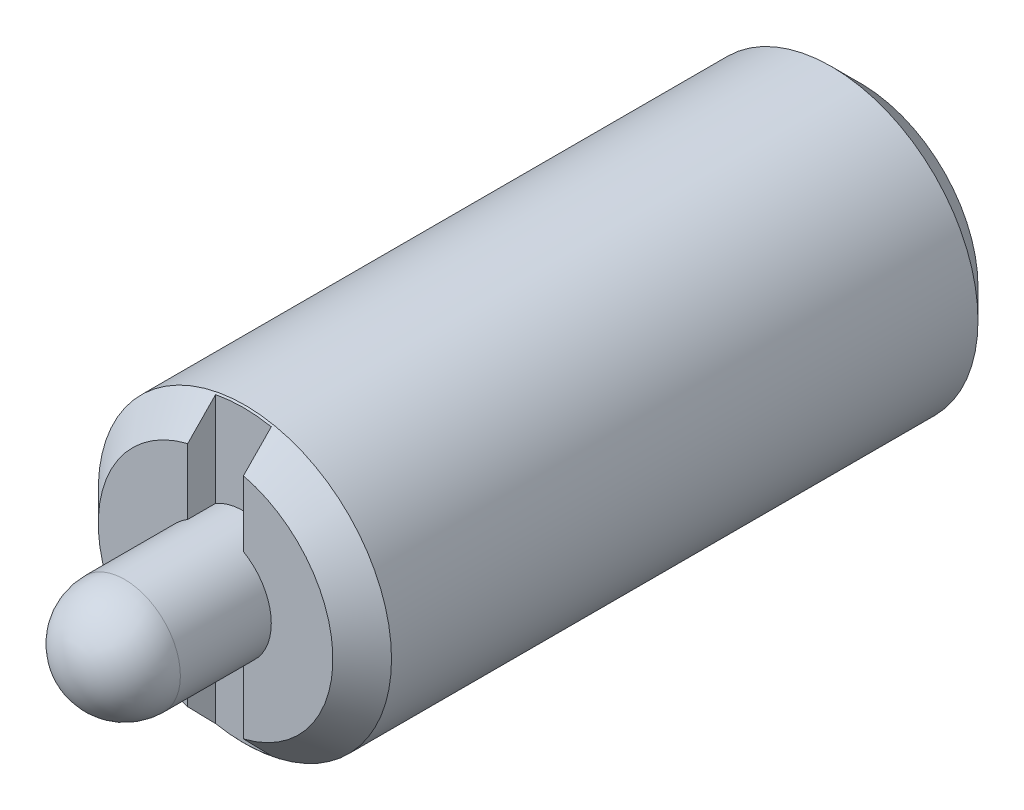
ISO-10303-21;
HEADER;
FILE_DESCRIPTION(('STEP AP214'),'2;1');
FILE_NAME('part.step','',(''),(''),'','','');
FILE_SCHEMA(('AUTOMOTIVE_DESIGN { 1 0 10303 214 1 1 1 1 }'));
ENDSEC;
DATA;
#1=APPLICATION_CONTEXT('core data for automotive mechanical design processes');
#2=APPLICATION_PROTOCOL_DEFINITION('international standard','automotive_design',2000,#1);
#3=PRODUCT_CONTEXT('',#1,'mechanical');
#4=PRODUCT('Part','Part','',(#3));
#5=PRODUCT_RELATED_PRODUCT_CATEGORY('part','',(#4));
#6=PRODUCT_DEFINITION_FORMATION('','',#4);
#7=PRODUCT_DEFINITION_CONTEXT('part definition',#1,'design');
#8=PRODUCT_DEFINITION('design','',#6,#7);
#9=PRODUCT_DEFINITION_SHAPE('','',#8);
#10=(LENGTH_UNIT() NAMED_UNIT(*) SI_UNIT(.MILLI.,.METRE.));
#11=(NAMED_UNIT(*) PLANE_ANGLE_UNIT() SI_UNIT($,.RADIAN.));
#12=(NAMED_UNIT(*) SI_UNIT($,.STERADIAN.) SOLID_ANGLE_UNIT());
#13=UNCERTAINTY_MEASURE_WITH_UNIT(LENGTH_MEASURE(1.E-05),#10,'distance_accuracy_value','');
#14=(GEOMETRIC_REPRESENTATION_CONTEXT(3) GLOBAL_UNCERTAINTY_ASSIGNED_CONTEXT((#13)) GLOBAL_UNIT_ASSIGNED_CONTEXT((#10,
#11,#12)) REPRESENTATION_CONTEXT('',''));
#15=CARTESIAN_POINT('',(0.,0.,0.));
#16=DIRECTION('',(0.,0.,1.));
#17=DIRECTION('',(1.,0.,0.));
#18=AXIS2_PLACEMENT_3D('',#15,#16,#17);
#19=CARTESIAN_POINT('',(0.,0.,0.));
#20=DIRECTION('',(0.,0.,-1.));
#21=DIRECTION('',(0.,-1.,0.));
#22=AXIS2_PLACEMENT_3D('',#19,#20,#21);
#23=PLANE('',#22);
#24=DIRECTION('',(0.866025403784439,0.5,0.));
#25=VECTOR('',#24,1.);
#26=CARTESIAN_POINT('',(0.75,-1.29903810567666,0.));
#27=LINE('',#26,#25);
#28=CARTESIAN_POINT('',(0.,-1.73205080756888,0.));
#29=VERTEX_POINT('',#28);
#30=CARTESIAN_POINT('',(1.5,-0.866025403784438,0.));
#31=VERTEX_POINT('',#30);
#32=EDGE_CURVE('E150',#29,#31,#27,.T.);
#33=ORIENTED_EDGE('',*,*,#32,.T.);
#34=DIRECTION('',(0.,1.,0.));
#35=VECTOR('',#34,1.);
#36=CARTESIAN_POINT('',(1.5,0.,0.));
#37=LINE('',#36,#35);
#38=CARTESIAN_POINT('',(1.5,0.866025403784438,0.));
#39=VERTEX_POINT('',#38);
#40=EDGE_CURVE('E250',#31,#39,#37,.T.);
#41=ORIENTED_EDGE('',*,*,#40,.T.);
#42=DIRECTION('',(-0.866025403784439,0.5,0.));
#43=VECTOR('',#42,1.);
#44=CARTESIAN_POINT('',(0.75,1.29903810567666,0.));
#45=LINE('',#44,#43);
#46=CARTESIAN_POINT('',(0.,1.73205080756888,0.));
#47=VERTEX_POINT('',#46);
#48=EDGE_CURVE('E243',#39,#47,#45,.T.);
#49=ORIENTED_EDGE('',*,*,#48,.T.);
#50=DIRECTION('',(-0.866025403784439,-0.5,0.));
#51=VECTOR('',#50,1.);
#52=CARTESIAN_POINT('',(-0.75,1.29903810567666,0.));
#53=LINE('',#52,#51);
#54=CARTESIAN_POINT('',(-1.5,0.866025403784438,0.));
#55=VERTEX_POINT('',#54);
#56=EDGE_CURVE('E218',#47,#55,#53,.T.);
#57=ORIENTED_EDGE('',*,*,#56,.T.);
#58=DIRECTION('',(0.,-1.,0.));
#59=VECTOR('',#58,1.);
#60=CARTESIAN_POINT('',(-1.5,0.,0.));
#61=LINE('',#60,#59);
#62=CARTESIAN_POINT('',(-1.5,-0.866025403784439,0.));
#63=VERTEX_POINT('',#62);
#64=EDGE_CURVE('E219',#55,#63,#61,.T.);
#65=ORIENTED_EDGE('',*,*,#64,.T.);
#66=DIRECTION('',(0.866025403784439,-0.5,0.));
#67=VECTOR('',#66,1.);
#68=CARTESIAN_POINT('',(-0.75,-1.29903810567666,0.));
#69=LINE('',#68,#67);
#70=EDGE_CURVE('E146',#63,#29,#69,.T.);
#71=ORIENTED_EDGE('',*,*,#70,.T.);
#72=EDGE_LOOP('',(#33,#41,#49,#57,#65,#71));
#73=FACE_BOUND('',#72,.T.);
#74=CARTESIAN_POINT('',(0.,0.,0.));
#75=DIRECTION('',(0.,0.,1.));
#76=DIRECTION('',(-1.,0.,0.));
#77=AXIS2_PLACEMENT_3D('',#74,#75,#76);
#78=CIRCLE('',#77,4.);
#79=CARTESIAN_POINT('',(4.,0.,0.));
#80=VERTEX_POINT('',#79);
#81=EDGE_CURVE('E11',#80,#80,#78,.T.);
#82=ORIENTED_EDGE('',*,*,#81,.F.);
#83=EDGE_LOOP('',(#82));
#84=FACE_BOUND('',#83,.T.);
#85=ADVANCED_FACE('F16',(#73,#84),#23,.T.);
#86=CARTESIAN_POINT('',(0.,0.,0.));
#87=DIRECTION('',(0.,0.,1.));
#88=DIRECTION('',(-1.,0.,0.));
#89=AXIS2_PLACEMENT_3D('',#86,#87,#88);
#90=CONICAL_SURFACE('',#89,4.,0.785398163397448);
#91=ORIENTED_EDGE('',*,*,#81,.T.);
#92=EDGE_LOOP('',(#91));
#93=FACE_BOUND('',#92,.T.);
#94=CARTESIAN_POINT('',(0.,0.,1.));
#95=DIRECTION('',(0.,0.,-1.));
#96=DIRECTION('',(-1.,0.,0.));
#97=AXIS2_PLACEMENT_3D('',#94,#95,#96);
#98=CIRCLE('',#97,5.);
#99=CARTESIAN_POINT('',(5.,0.,1.));
#100=VERTEX_POINT('',#99);
#101=EDGE_CURVE('E29',#100,#100,#98,.T.);
#102=ORIENTED_EDGE('',*,*,#101,.T.);
#103=EDGE_LOOP('',(#102));
#104=FACE_BOUND('',#103,.T.);
#105=ADVANCED_FACE('F479',(#93,#104),#90,.T.);
#106=CARTESIAN_POINT('',(0.,0.,11.));
#107=DIRECTION('',(0.,0.,-1.));
#108=DIRECTION('',(1.,0.,0.));
#109=AXIS2_PLACEMENT_3D('',#106,#107,#108);
#110=CYLINDRICAL_SURFACE('',#109,5.);
#111=CARTESIAN_POINT('',(0.,0.,21.));
#112=DIRECTION('',(0.,0.,1.));
#113=DIRECTION('',(-1.,0.,0.));
#114=AXIS2_PLACEMENT_3D('',#111,#112,#113);
#115=CIRCLE('',#114,5.);
#116=CARTESIAN_POINT('',(5.,0.,21.));
#117=VERTEX_POINT('',#116);
#118=EDGE_CURVE('E198',#117,#117,#115,.T.);
#119=ORIENTED_EDGE('',*,*,#118,.F.);
#120=EDGE_LOOP('',(#119));
#121=FACE_BOUND('',#120,.T.);
#122=ORIENTED_EDGE('',*,*,#101,.F.);
#123=EDGE_LOOP('',(#122));
#124=FACE_BOUND('',#123,.T.);
#125=ADVANCED_FACE('F593',(#121,#124),#110,.T.);
#126=CARTESIAN_POINT('',(0.,0.,22.));
#127=DIRECTION('',(0.,0.,-1.));
#128=DIRECTION('',(-1.,0.,0.));
#129=AXIS2_PLACEMENT_3D('',#126,#127,#128);
#130=CONICAL_SURFACE('',#129,4.,0.785398163397448);
#131=CARTESIAN_POINT('',(0.95,-3.88555015409659,22.));
#132=CARTESIAN_POINT('',(0.95,-4.32015706650129,21.5778282611336));
#133=CARTESIAN_POINT('',(0.95,-4.85798312059645,21.05));
#134=(BOUNDED_CURVE() B_SPLINE_CURVE(2,(#131,#132,#133),.UNSPECIFIED.,.F.,
.F.) B_SPLINE_CURVE_WITH_KNOTS((3,3),(0.,1.35945903612283),
.UNSPECIFIED.) CURVE() GEOMETRIC_REPRESENTATION_ITEM() RATIONAL_B_SPLINE_CURVE((1.,
1.00595537951627,1.)) REPRESENTATION_ITEM(''));
#135=CARTESIAN_POINT('',(0.95,-3.88555015409659,22.));
#136=VERTEX_POINT('',#135);
#137=CARTESIAN_POINT('',(0.95,-4.85798312059645,21.05));
#138=VERTEX_POINT('',#137);
#139=EDGE_CURVE('E190',#136,#138,#134,.T.);
#140=ORIENTED_EDGE('',*,*,#139,.T.);
#141=CARTESIAN_POINT('',(0.,0.,21.05));
#142=DIRECTION('',(0.,0.,-1.));
#143=DIRECTION('',(-1.,0.,0.));
#144=AXIS2_PLACEMENT_3D('',#141,#142,#143);
#145=CIRCLE('',#144,4.95);
#146=CARTESIAN_POINT('',(-0.95,-4.85798312059645,21.05));
#147=VERTEX_POINT('',#146);
#148=EDGE_CURVE('E269',#138,#147,#145,.T.);
#149=ORIENTED_EDGE('',*,*,#148,.T.);
#150=CARTESIAN_POINT('',(-0.95,-4.85798312059645,21.05));
#151=CARTESIAN_POINT('',(-0.95,-4.32015706650129,21.5778282611336));
#152=CARTESIAN_POINT('',(-0.95,-3.88555015409659,22.));
#153=(BOUNDED_CURVE() B_SPLINE_CURVE(2,(#150,#151,#152),.UNSPECIFIED.,.F.,
.F.) B_SPLINE_CURVE_WITH_KNOTS((3,3),(0.,1.35945903612283),
.UNSPECIFIED.) CURVE() GEOMETRIC_REPRESENTATION_ITEM() RATIONAL_B_SPLINE_CURVE((1.,
1.00595537951627,1.)) REPRESENTATION_ITEM(''));
#154=CARTESIAN_POINT('',(-0.95,-3.88555015409659,22.));
#155=VERTEX_POINT('',#154);
#156=EDGE_CURVE('E293',#147,#155,#153,.T.);
#157=ORIENTED_EDGE('',*,*,#156,.T.);
#158=CARTESIAN_POINT('',(0.,0.,22.));
#159=DIRECTION('',(0.,0.,-1.));
#160=DIRECTION('',(-1.,0.,0.));
#161=AXIS2_PLACEMENT_3D('',#158,#159,#160);
#162=CIRCLE('',#161,4.);
#163=CARTESIAN_POINT('',(-0.95,3.88555015409659,22.));
#164=VERTEX_POINT('',#163);
#165=EDGE_CURVE('E239',#155,#164,#162,.T.);
#166=ORIENTED_EDGE('',*,*,#165,.T.);
#167=CARTESIAN_POINT('',(-0.95,3.88555015409659,22.));
#168=CARTESIAN_POINT('',(-0.95,4.32015706650129,21.5778282611336));
#169=CARTESIAN_POINT('',(-0.95,4.85798312059645,21.05));
#170=(BOUNDED_CURVE() B_SPLINE_CURVE(2,(#167,#168,#169),.UNSPECIFIED.,.F.,
.F.) B_SPLINE_CURVE_WITH_KNOTS((3,3),(0.,1.35945903612283),
.UNSPECIFIED.) CURVE() GEOMETRIC_REPRESENTATION_ITEM() RATIONAL_B_SPLINE_CURVE((1.,
1.00595537951627,1.)) REPRESENTATION_ITEM(''));
#171=CARTESIAN_POINT('',(-0.95,4.85798312059645,21.05));
#172=VERTEX_POINT('',#171);
#173=EDGE_CURVE('E20',#164,#172,#170,.T.);
#174=ORIENTED_EDGE('',*,*,#173,.T.);
#175=CARTESIAN_POINT('',(0.,0.,21.05));
#176=DIRECTION('',(0.,0.,-1.));
#177=DIRECTION('',(-1.,0.,0.));
#178=AXIS2_PLACEMENT_3D('',#175,#176,#177);
#179=CIRCLE('',#178,4.95);
#180=CARTESIAN_POINT('',(0.95,4.85798312059645,21.05));
#181=VERTEX_POINT('',#180);
#182=EDGE_CURVE('E237',#172,#181,#179,.T.);
#183=ORIENTED_EDGE('',*,*,#182,.T.);
#184=CARTESIAN_POINT('',(0.95,4.85798312059645,21.05));
#185=CARTESIAN_POINT('',(0.95,4.32015706650129,21.5778282611336));
#186=CARTESIAN_POINT('',(0.95,3.88555015409659,22.));
#187=(BOUNDED_CURVE() B_SPLINE_CURVE(2,(#184,#185,#186),.UNSPECIFIED.,.F.,
.F.) B_SPLINE_CURVE_WITH_KNOTS((3,3),(0.,1.35945903612283),
.UNSPECIFIED.) CURVE() GEOMETRIC_REPRESENTATION_ITEM() RATIONAL_B_SPLINE_CURVE((1.,
1.00595537951627,1.)) REPRESENTATION_ITEM(''));
#188=CARTESIAN_POINT('',(0.95,3.88555015409659,22.));
#189=VERTEX_POINT('',#188);
#190=EDGE_CURVE('E204',#181,#189,#187,.T.);
#191=ORIENTED_EDGE('',*,*,#190,.T.);
#192=CARTESIAN_POINT('',(0.,0.,22.));
#193=DIRECTION('',(0.,0.,-1.));
#194=DIRECTION('',(-1.,0.,0.));
#195=AXIS2_PLACEMENT_3D('',#192,#193,#194);
#196=CIRCLE('',#195,4.);
#197=EDGE_CURVE('E195',#189,#136,#196,.T.);
#198=ORIENTED_EDGE('',*,*,#197,.T.);
#199=EDGE_LOOP('',(#140,#149,#157,#166,#174,#183,#191,#198));
#200=FACE_BOUND('',#199,.T.);
#201=ORIENTED_EDGE('',*,*,#118,.T.);
#202=EDGE_LOOP('',(#201));
#203=FACE_BOUND('',#202,.T.);
#204=ADVANCED_FACE('F376',(#200,#203),#130,.T.);
#205=CARTESIAN_POINT('',(0.,0.,22.));
#206=DIRECTION('',(0.,0.,1.));
#207=DIRECTION('',(1.,0.,0.));
#208=AXIS2_PLACEMENT_3D('',#205,#206,#207);
#209=PLANE('',#208);
#210=CARTESIAN_POINT('',(0.,0.,22.));
#211=DIRECTION('',(0.,0.,-1.));
#212=DIRECTION('',(1.,0.,0.));
#213=AXIS2_PLACEMENT_3D('',#210,#211,#212);
#214=CIRCLE('',#213,1.9);
#215=CARTESIAN_POINT('',(-0.95,-1.64544826719043,22.));
#216=VERTEX_POINT('',#215);
#217=CARTESIAN_POINT('',(-0.95,1.64544826719043,22.));
#218=VERTEX_POINT('',#217);
#219=EDGE_CURVE('E203',#216,#218,#214,.T.);
#220=ORIENTED_EDGE('',*,*,#219,.T.);
#221=DIRECTION('',(0.,1.,0.));
#222=VECTOR('',#221,1.);
#223=CARTESIAN_POINT('',(-0.95,0.,22.));
#224=LINE('',#223,#222);
#225=EDGE_CURVE('E240',#218,#164,#224,.T.);
#226=ORIENTED_EDGE('',*,*,#225,.T.);
#227=ORIENTED_EDGE('',*,*,#165,.F.);
#228=DIRECTION('',(0.,1.,0.));
#229=VECTOR('',#228,1.);
#230=CARTESIAN_POINT('',(-0.95,0.,22.));
#231=LINE('',#230,#229);
#232=EDGE_CURVE('E279',#155,#216,#231,.T.);
#233=ORIENTED_EDGE('',*,*,#232,.T.);
#234=EDGE_LOOP('',(#220,#226,#227,#233));
#235=FACE_BOUND('',#234,.T.);
#236=ADVANCED_FACE('F401',(#235),#209,.T.);
#237=CARTESIAN_POINT('',(0.,0.,21.05));
#238=DIRECTION('',(0.,0.,1.));
#239=DIRECTION('',(1.,0.,0.));
#240=AXIS2_PLACEMENT_3D('',#237,#238,#239);
#241=PLANE('',#240);
#242=CARTESIAN_POINT('',(0.,0.,21.05));
#243=DIRECTION('',(0.,0.,-1.));
#244=DIRECTION('',(1.,0.,0.));
#245=AXIS2_PLACEMENT_3D('',#242,#243,#244);
#246=CIRCLE('',#245,1.9);
#247=CARTESIAN_POINT('',(-0.95,1.64544826719043,21.05));
#248=VERTEX_POINT('',#247);
#249=CARTESIAN_POINT('',(0.95,1.64544826719043,21.05));
#250=VERTEX_POINT('',#249);
#251=EDGE_CURVE('E228',#248,#250,#246,.T.);
#252=ORIENTED_EDGE('',*,*,#251,.T.);
#253=DIRECTION('',(0.,-1.,0.));
#254=VECTOR('',#253,1.);
#255=CARTESIAN_POINT('',(0.95,0.,21.05));
#256=LINE('',#255,#254);
#257=EDGE_CURVE('E210',#181,#250,#256,.T.);
#258=ORIENTED_EDGE('',*,*,#257,.F.);
#259=ORIENTED_EDGE('',*,*,#182,.F.);
#260=DIRECTION('',(0.,1.,0.));
#261=VECTOR('',#260,1.);
#262=CARTESIAN_POINT('',(-0.95,0.,21.05));
#263=LINE('',#262,#261);
#264=EDGE_CURVE('E260',#248,#172,#263,.T.);
#265=ORIENTED_EDGE('',*,*,#264,.F.);
#266=EDGE_LOOP('',(#252,#258,#259,#265));
#267=FACE_BOUND('',#266,.T.);
#268=ADVANCED_FACE('F409',(#267),#241,.T.);
#269=CARTESIAN_POINT('',(-0.95,0.,21.525));
#270=DIRECTION('',(1.,0.,0.));
#271=DIRECTION('',(0.,1.,0.));
#272=AXIS2_PLACEMENT_3D('',#269,#270,#271);
#273=PLANE('',#272);
#274=DIRECTION('',(0.,0.,-1.));
#275=VECTOR('',#274,1.);
#276=CARTESIAN_POINT('',(-0.95,1.64544826719043,21.525));
#277=LINE('',#276,#275);
#278=EDGE_CURVE('E317',#218,#248,#277,.T.);
#279=ORIENTED_EDGE('',*,*,#278,.T.);
#280=ORIENTED_EDGE('',*,*,#264,.T.);
#281=ORIENTED_EDGE('',*,*,#173,.F.);
#282=ORIENTED_EDGE('',*,*,#225,.F.);
#283=EDGE_LOOP('',(#279,#280,#281,#282));
#284=FACE_BOUND('',#283,.T.);
#285=ADVANCED_FACE('F406',(#284),#273,.T.);
#286=CARTESIAN_POINT('',(1.5,0.,1.1));
#287=DIRECTION('',(-1.,0.,0.));
#288=DIRECTION('',(0.,0.,1.));
#289=AXIS2_PLACEMENT_3D('',#286,#287,#288);
#290=PLANE('',#289);
#291=DIRECTION('',(0.,0.,-1.));
#292=VECTOR('',#291,1.);
#293=CARTESIAN_POINT('',(1.5,-0.866025403784438,1.1));
#294=LINE('',#293,#292);
#295=CARTESIAN_POINT('',(1.5,-0.866025403784438,2.2));
#296=VERTEX_POINT('',#295);
#297=EDGE_CURVE('E182',#296,#31,#294,.T.);
#298=ORIENTED_EDGE('',*,*,#297,.F.);
#299=DIRECTION('',(0.,1.,0.));
#300=VECTOR('',#299,1.);
#301=CARTESIAN_POINT('',(1.5,0.,2.2));
#302=LINE('',#301,#300);
#303=CARTESIAN_POINT('',(1.5,0.866025403784438,2.2));
#304=VERTEX_POINT('',#303);
#305=EDGE_CURVE('E173',#296,#304,#302,.T.);
#306=ORIENTED_EDGE('',*,*,#305,.T.);
#307=DIRECTION('',(0.,0.,-1.));
#308=VECTOR('',#307,1.);
#309=CARTESIAN_POINT('',(1.5,0.866025403784438,1.1));
#310=LINE('',#309,#308);
#311=EDGE_CURVE('E236',#304,#39,#310,.T.);
#312=ORIENTED_EDGE('',*,*,#311,.T.);
#313=ORIENTED_EDGE('',*,*,#40,.F.);
#314=EDGE_LOOP('',(#298,#306,#312,#313));
#315=FACE_BOUND('',#314,.T.);
#316=ADVANCED_FACE('F347',(#315),#290,.T.);
#317=CARTESIAN_POINT('',(0.75,1.29903810567666,1.1));
#318=DIRECTION('',(-0.5,-0.866025403784439,0.));
#319=DIRECTION('',(-0.866025403784439,0.5,0.));
#320=AXIS2_PLACEMENT_3D('',#317,#318,#319);
#321=PLANE('',#320);
#322=ORIENTED_EDGE('',*,*,#311,.F.);
#323=DIRECTION('',(-0.866025403784439,0.5,0.));
#324=VECTOR('',#323,1.);
#325=CARTESIAN_POINT('',(0.75,1.29903810567666,2.2));
#326=LINE('',#325,#324);
#327=CARTESIAN_POINT('',(0.,1.73205080756888,2.2));
#328=VERTEX_POINT('',#327);
#329=EDGE_CURVE('E183',#304,#328,#326,.T.);
#330=ORIENTED_EDGE('',*,*,#329,.T.);
#331=DIRECTION('',(0.,0.,-1.));
#332=VECTOR('',#331,1.);
#333=CARTESIAN_POINT('',(0.,1.73205080756888,1.1));
#334=LINE('',#333,#332);
#335=EDGE_CURVE('E211',#328,#47,#334,.T.);
#336=ORIENTED_EDGE('',*,*,#335,.T.);
#337=ORIENTED_EDGE('',*,*,#48,.F.);
#338=EDGE_LOOP('',(#322,#330,#336,#337));
#339=FACE_BOUND('',#338,.T.);
#340=ADVANCED_FACE('F350',(#339),#321,.T.);
#341=CARTESIAN_POINT('',(-0.75,1.29903810567666,1.1));
#342=DIRECTION('',(0.5,-0.866025403784439,0.));
#343=DIRECTION('',(0.,0.,-1.));
#344=AXIS2_PLACEMENT_3D('',#341,#342,#343);
#345=PLANE('',#344);
#346=ORIENTED_EDGE('',*,*,#335,.F.);
#347=DIRECTION('',(-0.866025403784439,-0.5,0.));
#348=VECTOR('',#347,1.);
#349=CARTESIAN_POINT('',(-0.75,1.29903810567666,2.2));
#350=LINE('',#349,#348);
#351=CARTESIAN_POINT('',(-1.5,0.866025403784438,2.2));
#352=VERTEX_POINT('',#351);
#353=EDGE_CURVE('E161',#328,#352,#350,.T.);
#354=ORIENTED_EDGE('',*,*,#353,.T.);
#355=DIRECTION('',(0.,0.,-1.));
#356=VECTOR('',#355,1.);
#357=CARTESIAN_POINT('',(-1.5,0.866025403784438,1.1));
#358=LINE('',#357,#356);
#359=EDGE_CURVE('E156',#352,#55,#358,.T.);
#360=ORIENTED_EDGE('',*,*,#359,.T.);
#361=ORIENTED_EDGE('',*,*,#56,.F.);
#362=EDGE_LOOP('',(#346,#354,#360,#361));
#363=FACE_BOUND('',#362,.T.);
#364=ADVANCED_FACE('F552',(#363),#345,.T.);
#365=CARTESIAN_POINT('',(-1.5,0.,1.1));
#366=DIRECTION('',(1.,0.,0.));
#367=DIRECTION('',(0.,1.,0.));
#368=AXIS2_PLACEMENT_3D('',#365,#366,#367);
#369=PLANE('',#368);
#370=ORIENTED_EDGE('',*,*,#359,.F.);
#371=DIRECTION('',(0.,-1.,0.));
#372=VECTOR('',#371,1.);
#373=CARTESIAN_POINT('',(-1.5,0.,2.2));
#374=LINE('',#373,#372);
#375=CARTESIAN_POINT('',(-1.5,-0.866025403784439,2.2));
#376=VERTEX_POINT('',#375);
#377=EDGE_CURVE('E153',#352,#376,#374,.T.);
#378=ORIENTED_EDGE('',*,*,#377,.T.);
#379=DIRECTION('',(0.,0.,-1.));
#380=VECTOR('',#379,1.);
#381=CARTESIAN_POINT('',(-1.5,-0.866025403784439,1.1));
#382=LINE('',#381,#380);
#383=EDGE_CURVE('E140',#376,#63,#382,.T.);
#384=ORIENTED_EDGE('',*,*,#383,.T.);
#385=ORIENTED_EDGE('',*,*,#64,.F.);
#386=EDGE_LOOP('',(#370,#378,#384,#385));
#387=FACE_BOUND('',#386,.T.);
#388=ADVANCED_FACE('F154',(#387),#369,.T.);
#389=CARTESIAN_POINT('',(-0.75,-1.29903810567666,1.1));
#390=DIRECTION('',(0.5,0.866025403784439,0.));
#391=DIRECTION('',(0.,0.,-1.));
#392=AXIS2_PLACEMENT_3D('',#389,#390,#391);
#393=PLANE('',#392);
#394=ORIENTED_EDGE('',*,*,#383,.F.);
#395=DIRECTION('',(0.866025403784439,-0.5,0.));
#396=VECTOR('',#395,1.);
#397=CARTESIAN_POINT('',(-0.75,-1.29903810567666,2.2));
#398=LINE('',#397,#396);
#399=CARTESIAN_POINT('',(0.,-1.73205080756888,2.2));
#400=VERTEX_POINT('',#399);
#401=EDGE_CURVE('E144',#376,#400,#398,.T.);
#402=ORIENTED_EDGE('',*,*,#401,.T.);
#403=DIRECTION('',(0.,0.,-1.));
#404=VECTOR('',#403,1.);
#405=CARTESIAN_POINT('',(0.,-1.73205080756888,1.1));
#406=LINE('',#405,#404);
#407=EDGE_CURVE('E179',#400,#29,#406,.T.);
#408=ORIENTED_EDGE('',*,*,#407,.T.);
#409=ORIENTED_EDGE('',*,*,#70,.F.);
#410=EDGE_LOOP('',(#394,#402,#408,#409));
#411=FACE_BOUND('',#410,.T.);
#412=ADVANCED_FACE('F18',(#411),#393,.T.);
#413=CARTESIAN_POINT('',(0.75,-1.29903810567666,1.1));
#414=DIRECTION('',(-0.5,0.866025403784439,0.));
#415=DIRECTION('',(0.,0.,1.));
#416=AXIS2_PLACEMENT_3D('',#413,#414,#415);
#417=PLANE('',#416);
#418=ORIENTED_EDGE('',*,*,#407,.F.);
#419=DIRECTION('',(0.866025403784439,0.5,0.));
#420=VECTOR('',#419,1.);
#421=CARTESIAN_POINT('',(0.75,-1.29903810567666,2.2));
#422=LINE('',#421,#420);
#423=EDGE_CURVE('E166',#400,#296,#422,.T.);
#424=ORIENTED_EDGE('',*,*,#423,.T.);
#425=ORIENTED_EDGE('',*,*,#297,.T.);
#426=ORIENTED_EDGE('',*,*,#32,.F.);
#427=EDGE_LOOP('',(#418,#424,#425,#426));
#428=FACE_BOUND('',#427,.T.);
#429=ADVANCED_FACE('F346',(#428),#417,.T.);
#430=CARTESIAN_POINT('',(0.,0.,2.2));
#431=DIRECTION('',(0.,0.,1.));
#432=DIRECTION('',(1.,0.,0.));
#433=AXIS2_PLACEMENT_3D('',#430,#431,#432);
#434=PLANE('',#433);
#435=ORIENTED_EDGE('',*,*,#305,.F.);
#436=ORIENTED_EDGE('',*,*,#423,.F.);
#437=ORIENTED_EDGE('',*,*,#401,.F.);
#438=ORIENTED_EDGE('',*,*,#377,.F.);
#439=ORIENTED_EDGE('',*,*,#353,.F.);
#440=ORIENTED_EDGE('',*,*,#329,.F.);
#441=EDGE_LOOP('',(#435,#436,#437,#438,#439,#440));
#442=FACE_BOUND('',#441,.T.);
#443=ADVANCED_FACE('F164',(#442),#434,.F.);
#444=CARTESIAN_POINT('',(-0.95,0.,21.525));
#445=DIRECTION('',(1.,0.,0.));
#446=DIRECTION('',(0.,1.,0.));
#447=AXIS2_PLACEMENT_3D('',#444,#445,#446);
#448=PLANE('',#447);
#449=DIRECTION('',(0.,0.,1.));
#450=VECTOR('',#449,1.);
#451=CARTESIAN_POINT('',(-0.95,-1.64544826719043,21.525));
#452=LINE('',#451,#450);
#453=CARTESIAN_POINT('',(-0.95,-1.64544826719043,21.05));
#454=VERTEX_POINT('',#453);
#455=EDGE_CURVE('E223',#454,#216,#452,.T.);
#456=ORIENTED_EDGE('',*,*,#455,.T.);
#457=ORIENTED_EDGE('',*,*,#232,.F.);
#458=ORIENTED_EDGE('',*,*,#156,.F.);
#459=DIRECTION('',(0.,1.,0.));
#460=VECTOR('',#459,1.);
#461=CARTESIAN_POINT('',(-0.95,0.,21.05));
#462=LINE('',#461,#460);
#463=EDGE_CURVE('E267',#147,#454,#462,.T.);
#464=ORIENTED_EDGE('',*,*,#463,.T.);
#465=EDGE_LOOP('',(#456,#457,#458,#464));
#466=FACE_BOUND('',#465,.T.);
#467=ADVANCED_FACE('F399',(#466),#448,.T.);
#468=CARTESIAN_POINT('',(0.,0.,21.05));
#469=DIRECTION('',(0.,0.,1.));
#470=DIRECTION('',(1.,0.,0.));
#471=AXIS2_PLACEMENT_3D('',#468,#469,#470);
#472=PLANE('',#471);
#473=CARTESIAN_POINT('',(0.,0.,21.05));
#474=DIRECTION('',(0.,0.,-1.));
#475=DIRECTION('',(1.,0.,0.));
#476=AXIS2_PLACEMENT_3D('',#473,#474,#475);
#477=CIRCLE('',#476,1.9);
#478=CARTESIAN_POINT('',(0.95,-1.64544826719043,21.05));
#479=VERTEX_POINT('',#478);
#480=EDGE_CURVE('E177',#479,#454,#477,.T.);
#481=ORIENTED_EDGE('',*,*,#480,.T.);
#482=ORIENTED_EDGE('',*,*,#463,.F.);
#483=ORIENTED_EDGE('',*,*,#148,.F.);
#484=DIRECTION('',(0.,-1.,0.));
#485=VECTOR('',#484,1.);
#486=CARTESIAN_POINT('',(0.95,0.,21.05));
#487=LINE('',#486,#485);
#488=EDGE_CURVE('E186',#479,#138,#487,.T.);
#489=ORIENTED_EDGE('',*,*,#488,.F.);
#490=EDGE_LOOP('',(#481,#482,#483,#489));
#491=FACE_BOUND('',#490,.T.);
#492=ADVANCED_FACE('F390',(#491),#472,.T.);
#493=CARTESIAN_POINT('',(0.95,0.,21.525));
#494=DIRECTION('',(-1.,0.,0.));
#495=DIRECTION('',(0.,0.,1.));
#496=AXIS2_PLACEMENT_3D('',#493,#494,#495);
#497=PLANE('',#496);
#498=DIRECTION('',(0.,0.,1.));
#499=VECTOR('',#498,1.);
#500=CARTESIAN_POINT('',(0.95,1.64544826719043,21.525));
#501=LINE('',#500,#499);
#502=CARTESIAN_POINT('',(0.95,1.64544826719043,22.));
#503=VERTEX_POINT('',#502);
#504=EDGE_CURVE('E224',#250,#503,#501,.T.);
#505=ORIENTED_EDGE('',*,*,#504,.T.);
#506=DIRECTION('',(0.,-1.,0.));
#507=VECTOR('',#506,1.);
#508=CARTESIAN_POINT('',(0.95,0.,22.));
#509=LINE('',#508,#507);
#510=EDGE_CURVE('E191',#189,#503,#509,.T.);
#511=ORIENTED_EDGE('',*,*,#510,.F.);
#512=ORIENTED_EDGE('',*,*,#190,.F.);
#513=ORIENTED_EDGE('',*,*,#257,.T.);
#514=EDGE_LOOP('',(#505,#511,#512,#513));
#515=FACE_BOUND('',#514,.T.);
#516=ADVANCED_FACE('F379',(#515),#497,.T.);
#517=CARTESIAN_POINT('',(0.95,0.,21.525));
#518=DIRECTION('',(-1.,0.,0.));
#519=DIRECTION('',(0.,0.,1.));
#520=AXIS2_PLACEMENT_3D('',#517,#518,#519);
#521=PLANE('',#520);
#522=DIRECTION('',(0.,0.,-1.));
#523=VECTOR('',#522,1.);
#524=CARTESIAN_POINT('',(0.95,-1.64544826719043,21.525));
#525=LINE('',#524,#523);
#526=CARTESIAN_POINT('',(0.95,-1.64544826719043,22.));
#527=VERTEX_POINT('',#526);
#528=EDGE_CURVE('E291',#527,#479,#525,.T.);
#529=ORIENTED_EDGE('',*,*,#528,.T.);
#530=ORIENTED_EDGE('',*,*,#488,.T.);
#531=ORIENTED_EDGE('',*,*,#139,.F.);
#532=DIRECTION('',(0.,-1.,0.));
#533=VECTOR('',#532,1.);
#534=CARTESIAN_POINT('',(0.95,0.,22.));
#535=LINE('',#534,#533);
#536=EDGE_CURVE('E199',#527,#136,#535,.T.);
#537=ORIENTED_EDGE('',*,*,#536,.F.);
#538=EDGE_LOOP('',(#529,#530,#531,#537));
#539=FACE_BOUND('',#538,.T.);
#540=ADVANCED_FACE('F386',(#539),#521,.T.);
#541=CARTESIAN_POINT('',(0.,0.,22.));
#542=DIRECTION('',(0.,0.,1.));
#543=DIRECTION('',(1.,0.,0.));
#544=AXIS2_PLACEMENT_3D('',#541,#542,#543);
#545=PLANE('',#544);
#546=CARTESIAN_POINT('',(0.,0.,22.));
#547=DIRECTION('',(0.,0.,-1.));
#548=DIRECTION('',(1.,0.,0.));
#549=AXIS2_PLACEMENT_3D('',#546,#547,#548);
#550=CIRCLE('',#549,1.9);
#551=EDGE_CURVE('E229',#503,#527,#550,.T.);
#552=ORIENTED_EDGE('',*,*,#551,.T.);
#553=ORIENTED_EDGE('',*,*,#536,.T.);
#554=ORIENTED_EDGE('',*,*,#197,.F.);
#555=ORIENTED_EDGE('',*,*,#510,.T.);
#556=EDGE_LOOP('',(#552,#553,#554,#555));
#557=FACE_BOUND('',#556,.T.);
#558=ADVANCED_FACE('F382',(#557),#545,.T.);
#559=CARTESIAN_POINT('',(0.,0.,25.1));
#560=DIRECTION('',(0.,0.,1.));
#561=DIRECTION('',(1.,0.,0.));
#562=AXIS2_PLACEMENT_3D('',#559,#560,#561);
#563=SPHERICAL_SURFACE('',#562,1.9);
#564=CARTESIAN_POINT('',(0.,0.,25.1));
#565=DIRECTION('',(0.,0.,1.));
#566=DIRECTION('',(1.,0.,0.));
#567=AXIS2_PLACEMENT_3D('',#564,#565,#566);
#568=CIRCLE('',#567,1.9);
#569=CARTESIAN_POINT('',(1.9,0.,25.1));
#570=VERTEX_POINT('',#569);
#571=EDGE_CURVE('E220',#570,#570,#568,.T.);
#572=ORIENTED_EDGE('',*,*,#571,.T.);
#573=EDGE_LOOP('',(#572));
#574=FACE_BOUND('',#573,.T.);
#575=ADVANCED_FACE('F492',(#574),#563,.T.);
#576=CARTESIAN_POINT('',(0.,0.,21.35));
#577=DIRECTION('',(0.,0.,-1.));
#578=DIRECTION('',(1.,0.,0.));
#579=AXIS2_PLACEMENT_3D('',#576,#577,#578);
#580=CYLINDRICAL_SURFACE('',#579,1.9);
#581=ORIENTED_EDGE('',*,*,#455,.F.);
#582=ORIENTED_EDGE('',*,*,#480,.F.);
#583=ORIENTED_EDGE('',*,*,#528,.F.);
#584=ORIENTED_EDGE('',*,*,#551,.F.);
#585=ORIENTED_EDGE('',*,*,#504,.F.);
#586=ORIENTED_EDGE('',*,*,#251,.F.);
#587=ORIENTED_EDGE('',*,*,#278,.F.);
#588=ORIENTED_EDGE('',*,*,#219,.F.);
#589=EDGE_LOOP('',(#581,#582,#583,#584,#585,#586,#587,#588));
#590=FACE_BOUND('',#589,.T.);
#591=ORIENTED_EDGE('',*,*,#571,.F.);
#592=EDGE_LOOP('',(#591));
#593=FACE_BOUND('',#592,.T.);
#594=ADVANCED_FACE('F395',(#590,#593),#580,.T.);
#595=CLOSED_SHELL('',(#85,#105,#125,#204,#236,#268,#285,#316,#340,#364,#388,#412,#429,#443,#467,
#492,#516,#540,#558,#575,#594));
#596=MANIFOLD_SOLID_BREP('B1',#595);
#597=ADVANCED_BREP_SHAPE_REPRESENTATION('',(#18,#596),#14);
#598=SHAPE_DEFINITION_REPRESENTATION(#9,#597);
ENDSEC;
END-ISO-10303-21;
